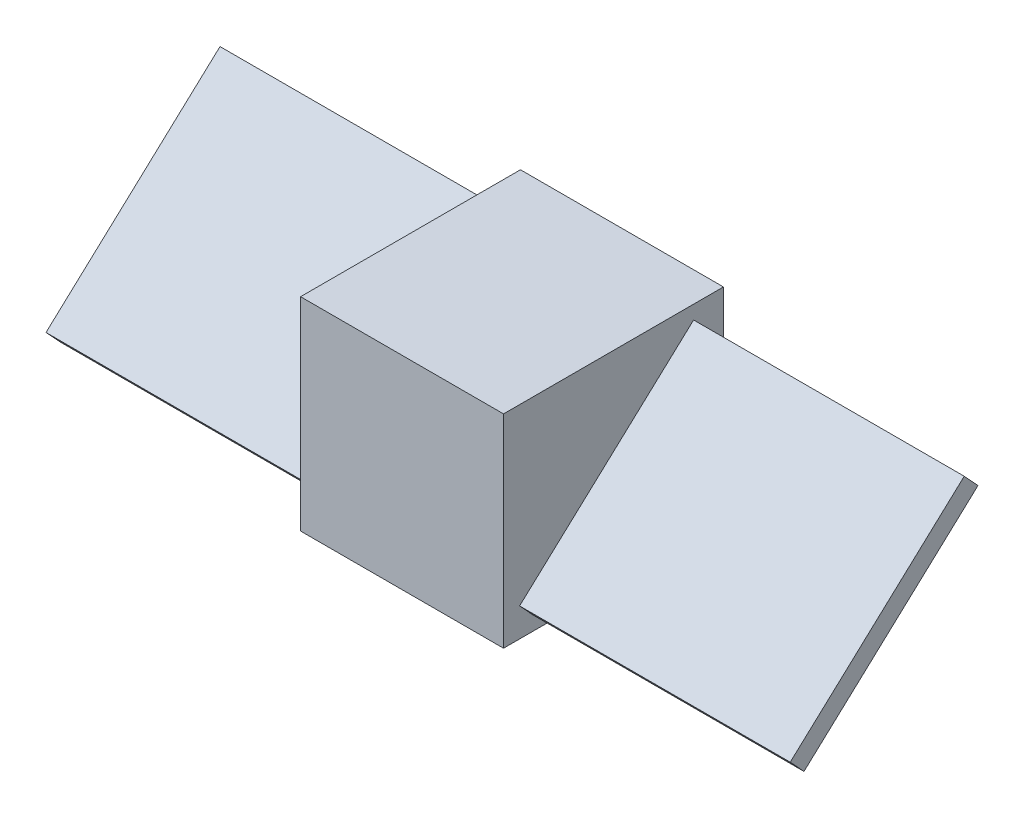
ISO-10303-21;
HEADER;
FILE_DESCRIPTION(('STEP AP214'),'2;1');
FILE_NAME('part.step','',(''),(''),'','','');
FILE_SCHEMA(('AUTOMOTIVE_DESIGN { 1 0 10303 214 1 1 1 1 }'));
ENDSEC;
DATA;
#1=APPLICATION_CONTEXT('core data for automotive mechanical design processes');
#2=APPLICATION_PROTOCOL_DEFINITION('international standard','automotive_design',2000,#1);
#3=PRODUCT_CONTEXT('',#1,'mechanical');
#4=PRODUCT('Part','Part','',(#3));
#5=PRODUCT_RELATED_PRODUCT_CATEGORY('part','',(#4));
#6=PRODUCT_DEFINITION_FORMATION('','',#4);
#7=PRODUCT_DEFINITION_CONTEXT('part definition',#1,'design');
#8=PRODUCT_DEFINITION('design','',#6,#7);
#9=PRODUCT_DEFINITION_SHAPE('','',#8);
#10=(LENGTH_UNIT() NAMED_UNIT(*) SI_UNIT(.MILLI.,.METRE.));
#11=(NAMED_UNIT(*) PLANE_ANGLE_UNIT() SI_UNIT($,.RADIAN.));
#12=(NAMED_UNIT(*) SI_UNIT($,.STERADIAN.) SOLID_ANGLE_UNIT());
#13=UNCERTAINTY_MEASURE_WITH_UNIT(LENGTH_MEASURE(1.E-05),#10,'distance_accuracy_value','');
#14=(GEOMETRIC_REPRESENTATION_CONTEXT(3) GLOBAL_UNCERTAINTY_ASSIGNED_CONTEXT((#13)) GLOBAL_UNIT_ASSIGNED_CONTEXT((#10,
#11,#12)) REPRESENTATION_CONTEXT('',''));
#15=CARTESIAN_POINT('',(0.,0.,0.));
#16=DIRECTION('',(0.,0.,1.));
#17=DIRECTION('',(1.,0.,0.));
#18=AXIS2_PLACEMENT_3D('',#15,#16,#17);
#19=CARTESIAN_POINT('',(-110.,37.5417205285646,-40.6701972392784));
#20=DIRECTION('',(0.,0.678280102733066,-0.734803444627488));
#21=DIRECTION('',(0.,0.734803444627488,0.678280102733066));
#22=AXIS2_PLACEMENT_3D('',#19,#20,#21);
#23=PLANE('',#22);
#24=DIRECTION('',(0.,-0.734803444627488,-0.678280102733066));
#25=VECTOR('',#24,1.);
#26=CARTESIAN_POINT('',(-30.,37.5417205285646,-40.6701972392784));
#27=LINE('',#26,#25);
#28=CARTESIAN_POINT('',(-30.,55.9442139295398,-23.6832802537629));
#29=VERTEX_POINT('',#28);
#30=CARTESIAN_POINT('',(-30.,51.5353932617748,-27.7529608701613));
#31=VERTEX_POINT('',#30);
#32=EDGE_CURVE('E113',#29,#31,#27,.T.);
#33=ORIENTED_EDGE('',*,*,#32,.T.);
#34=DIRECTION('',(1.,0.,0.));
#35=VECTOR('',#34,1.);
#36=CARTESIAN_POINT('',(-110.,51.5353932617748,-27.7529608701613));
#37=LINE('',#36,#35);
#38=CARTESIAN_POINT('',(-110.,51.5353932617748,-27.7529608701613));
#39=VERTEX_POINT('',#38);
#40=EDGE_CURVE('E111',#39,#31,#37,.T.);
#41=ORIENTED_EDGE('',*,*,#40,.F.);
#42=DIRECTION('',(0.,-0.734803444627488,-0.678280102733066));
#43=VECTOR('',#42,1.);
#44=CARTESIAN_POINT('',(-110.,37.5417205285646,-40.6701972392784));
#45=LINE('',#44,#43);
#46=CARTESIAN_POINT('',(-110.,55.9442139295398,-23.6832802537629));
#47=VERTEX_POINT('',#46);
#48=EDGE_CURVE('E108',#47,#39,#45,.T.);
#49=ORIENTED_EDGE('',*,*,#48,.F.);
#50=DIRECTION('',(1.,0.,0.));
#51=VECTOR('',#50,1.);
#52=CARTESIAN_POINT('',(-110.,55.9442139295398,-23.6832802537629));
#53=LINE('',#52,#51);
#54=EDGE_CURVE('E12',#47,#29,#53,.T.);
#55=ORIENTED_EDGE('',*,*,#54,.T.);
#56=EDGE_LOOP('',(#33,#41,#49,#55));
#57=FACE_BOUND('',#56,.T.);
#58=ADVANCED_FACE('F55',(#57),#23,.T.);
#59=CARTESIAN_POINT('',(-110.,18.4024934009751,16.9869169855155));
#60=DIRECTION('',(0.,0.734803444627488,0.678280102733066));
#61=DIRECTION('',(0.,-0.678280102733066,0.734803444627488));
#62=AXIS2_PLACEMENT_3D('',#59,#60,#61);
#63=PLANE('',#62);
#64=DIRECTION('',(0.,0.678280102733066,-0.734803444627488));
#65=VECTOR('',#64,1.);
#66=CARTESIAN_POINT('',(-30.,18.4024934009751,16.9869169855155));
#67=LINE('',#66,#65);
#68=CARTESIAN_POINT('',(-30.,8.46460673822518,27.7529608701613));
#69=VERTEX_POINT('',#68);
#70=EDGE_CURVE('E117',#69,#29,#67,.T.);
#71=ORIENTED_EDGE('',*,*,#70,.T.);
#72=ORIENTED_EDGE('',*,*,#54,.F.);
#73=DIRECTION('',(0.,0.678280102733066,-0.734803444627488));
#74=VECTOR('',#73,1.);
#75=CARTESIAN_POINT('',(-110.,18.4024934009751,16.9869169855155));
#76=LINE('',#75,#74);
#77=CARTESIAN_POINT('',(-110.,8.46460673822518,27.7529608701613));
#78=VERTEX_POINT('',#77);
#79=EDGE_CURVE('E91',#78,#47,#76,.T.);
#80=ORIENTED_EDGE('',*,*,#79,.F.);
#81=DIRECTION('',(1.,0.,0.));
#82=VECTOR('',#81,1.);
#83=CARTESIAN_POINT('',(-110.,8.46460673822518,27.7529608701613));
#84=LINE('',#83,#82);
#85=EDGE_CURVE('E58',#78,#69,#84,.T.);
#86=ORIENTED_EDGE('',*,*,#85,.T.);
#87=EDGE_LOOP('',(#71,#72,#80,#86));
#88=FACE_BOUND('',#87,.T.);
#89=ADVANCED_FACE('F110',(#88),#63,.T.);
#90=CARTESIAN_POINT('',(-110.,-9.93788666274995,10.7660438846458));
#91=DIRECTION('',(0.,0.678280102733066,-0.734803444627488));
#92=DIRECTION('',(0.,0.734803444627488,0.678280102733066));
#93=AXIS2_PLACEMENT_3D('',#90,#91,#92);
#94=PLANE('',#93);
#95=DIRECTION('',(0.,-0.734803444627488,-0.678280102733066));
#96=VECTOR('',#95,1.);
#97=CARTESIAN_POINT('',(-30.,-9.93788666274995,10.7660438846458));
#98=LINE('',#97,#96);
#99=CARTESIAN_POINT('',(-30.,4.05578607046024,23.6832802537629));
#100=VERTEX_POINT('',#99);
#101=EDGE_CURVE('E103',#69,#100,#98,.T.);
#102=ORIENTED_EDGE('',*,*,#101,.F.);
#103=ORIENTED_EDGE('',*,*,#85,.F.);
#104=DIRECTION('',(0.,-0.734803444627488,-0.678280102733066));
#105=VECTOR('',#104,1.);
#106=CARTESIAN_POINT('',(-110.,-9.93788666274995,10.7660438846458));
#107=LINE('',#106,#105);
#108=CARTESIAN_POINT('',(-110.,4.05578607046024,23.6832802537629));
#109=VERTEX_POINT('',#108);
#110=EDGE_CURVE('E96',#78,#109,#107,.T.);
#111=ORIENTED_EDGE('',*,*,#110,.T.);
#112=DIRECTION('',(1.,0.,0.));
#113=VECTOR('',#112,1.);
#114=CARTESIAN_POINT('',(-110.,4.05578607046024,23.6832802537629));
#115=LINE('',#114,#113);
#116=EDGE_CURVE('E106',#109,#100,#115,.T.);
#117=ORIENTED_EDGE('',*,*,#116,.T.);
#118=EDGE_LOOP('',(#102,#103,#111,#117));
#119=FACE_BOUND('',#118,.T.);
#120=ADVANCED_FACE('F105',(#119),#94,.F.);
#121=CARTESIAN_POINT('',(-110.,13.9936727332102,12.9172363691171));
#122=DIRECTION('',(0.,0.734803444627488,0.678280102733066));
#123=DIRECTION('',(0.,-0.678280102733066,0.734803444627488));
#124=AXIS2_PLACEMENT_3D('',#121,#122,#123);
#125=PLANE('',#124);
#126=DIRECTION('',(0.,0.678280102733066,-0.734803444627488));
#127=VECTOR('',#126,1.);
#128=CARTESIAN_POINT('',(-30.,13.9936727332102,12.9172363691171));
#129=LINE('',#128,#127);
#130=EDGE_CURVE('E85',#100,#31,#129,.T.);
#131=ORIENTED_EDGE('',*,*,#130,.F.);
#132=ORIENTED_EDGE('',*,*,#116,.F.);
#133=DIRECTION('',(0.,0.678280102733066,-0.734803444627488));
#134=VECTOR('',#133,1.);
#135=CARTESIAN_POINT('',(-110.,13.9936727332102,12.9172363691171));
#136=LINE('',#135,#134);
#137=EDGE_CURVE('E69',#109,#39,#136,.T.);
#138=ORIENTED_EDGE('',*,*,#137,.T.);
#139=ORIENTED_EDGE('',*,*,#40,.T.);
#140=EDGE_LOOP('',(#131,#132,#138,#139));
#141=FACE_BOUND('',#140,.T.);
#142=ADVANCED_FACE('F127',(#141),#125,.F.);
#143=CARTESIAN_POINT('',(-110.,0.,0.));
#144=DIRECTION('',(-1.,0.,0.));
#145=DIRECTION('',(0.,0.,-1.));
#146=AXIS2_PLACEMENT_3D('',#143,#144,#145);
#147=PLANE('',#146);
#148=ORIENTED_EDGE('',*,*,#48,.T.);
#149=ORIENTED_EDGE('',*,*,#137,.F.);
#150=ORIENTED_EDGE('',*,*,#110,.F.);
#151=ORIENTED_EDGE('',*,*,#79,.T.);
#152=EDGE_LOOP('',(#148,#149,#150,#151));
#153=FACE_BOUND('',#152,.T.);
#154=ADVANCED_FACE('F98',(#153),#147,.T.);
#155=CARTESIAN_POINT('',(-30.,0.,0.));
#156=DIRECTION('',(-1.,0.,0.));
#157=DIRECTION('',(0.,0.,-1.));
#158=AXIS2_PLACEMENT_3D('',#155,#156,#157);
#159=PLANE('',#158);
#160=ORIENTED_EDGE('',*,*,#32,.F.);
#161=ORIENTED_EDGE('',*,*,#70,.F.);
#162=ORIENTED_EDGE('',*,*,#101,.T.);
#163=ORIENTED_EDGE('',*,*,#130,.T.);
#164=EDGE_LOOP('',(#160,#161,#162,#163));
#165=FACE_BOUND('',#164,.T.);
#166=ADVANCED_FACE('F124',(#165),#159,.F.);
#167=CLOSED_SHELL('',(#58,#89,#120,#142,#154,#166));
#168=MANIFOLD_SOLID_BREP('B2',#167);
#169=CARTESIAN_POINT('',(110.,37.5417205285646,-40.6701972392784));
#170=DIRECTION('',(0.,0.678280102733066,-0.734803444627488));
#171=DIRECTION('',(0.,0.734803444627488,0.678280102733066));
#172=AXIS2_PLACEMENT_3D('',#169,#170,#171);
#173=PLANE('',#172);
#174=DIRECTION('',(0.,-0.734803444627488,-0.678280102733066));
#175=VECTOR('',#174,1.);
#176=CARTESIAN_POINT('',(30.,37.5417205285646,-40.6701972392784));
#177=LINE('',#176,#175);
#178=CARTESIAN_POINT('',(30.,55.9442139295398,-23.6832802537629));
#179=VERTEX_POINT('',#178);
#180=CARTESIAN_POINT('',(30.,51.5353932617748,-27.7529608701613));
#181=VERTEX_POINT('',#180);
#182=EDGE_CURVE('E249',#179,#181,#177,.T.);
#183=ORIENTED_EDGE('',*,*,#182,.F.);
#184=DIRECTION('',(-1.,0.,0.));
#185=VECTOR('',#184,1.);
#186=CARTESIAN_POINT('',(110.,55.9442139295398,-23.6832802537629));
#187=LINE('',#186,#185);
#188=CARTESIAN_POINT('',(110.,55.9442139295398,-23.6832802537629));
#189=VERTEX_POINT('',#188);
#190=EDGE_CURVE('E49',#189,#179,#187,.T.);
#191=ORIENTED_EDGE('',*,*,#190,.F.);
#192=DIRECTION('',(0.,-0.734803444627488,-0.678280102733066));
#193=VECTOR('',#192,1.);
#194=CARTESIAN_POINT('',(110.,37.5417205285646,-40.6701972392784));
#195=LINE('',#194,#193);
#196=CARTESIAN_POINT('',(110.,51.5353932617748,-27.7529608701613));
#197=VERTEX_POINT('',#196);
#198=EDGE_CURVE('E244',#189,#197,#195,.T.);
#199=ORIENTED_EDGE('',*,*,#198,.T.);
#200=DIRECTION('',(-1.,0.,0.));
#201=VECTOR('',#200,1.);
#202=CARTESIAN_POINT('',(110.,51.5353932617748,-27.7529608701613));
#203=LINE('',#202,#201);
#204=EDGE_CURVE('E224',#197,#181,#203,.T.);
#205=ORIENTED_EDGE('',*,*,#204,.T.);
#206=EDGE_LOOP('',(#183,#191,#199,#205));
#207=FACE_BOUND('',#206,.T.);
#208=ADVANCED_FACE('F183',(#207),#173,.T.);
#209=CARTESIAN_POINT('',(110.,18.4024934009751,16.9869169855155));
#210=DIRECTION('',(0.,0.734803444627488,0.678280102733066));
#211=DIRECTION('',(0.,-0.678280102733066,0.734803444627488));
#212=AXIS2_PLACEMENT_3D('',#209,#210,#211);
#213=PLANE('',#212);
#214=DIRECTION('',(0.,0.678280102733066,-0.734803444627488));
#215=VECTOR('',#214,1.);
#216=CARTESIAN_POINT('',(30.,18.4024934009751,16.9869169855155));
#217=LINE('',#216,#215);
#218=CARTESIAN_POINT('',(30.,8.46460673822518,27.7529608701613));
#219=VERTEX_POINT('',#218);
#220=EDGE_CURVE('E237',#219,#179,#217,.T.);
#221=ORIENTED_EDGE('',*,*,#220,.F.);
#222=DIRECTION('',(-1.,0.,0.));
#223=VECTOR('',#222,1.);
#224=CARTESIAN_POINT('',(110.,8.46460673822518,27.7529608701613));
#225=LINE('',#224,#223);
#226=CARTESIAN_POINT('',(110.,8.46460673822518,27.7529608701613));
#227=VERTEX_POINT('',#226);
#228=EDGE_CURVE('E194',#227,#219,#225,.T.);
#229=ORIENTED_EDGE('',*,*,#228,.F.);
#230=DIRECTION('',(0.,0.678280102733066,-0.734803444627488));
#231=VECTOR('',#230,1.);
#232=CARTESIAN_POINT('',(110.,18.4024934009751,16.9869169855155));
#233=LINE('',#232,#231);
#234=EDGE_CURVE('E231',#227,#189,#233,.T.);
#235=ORIENTED_EDGE('',*,*,#234,.T.);
#236=ORIENTED_EDGE('',*,*,#190,.T.);
#237=EDGE_LOOP('',(#221,#229,#235,#236));
#238=FACE_BOUND('',#237,.T.);
#239=ADVANCED_FACE('F235',(#238),#213,.T.);
#240=CARTESIAN_POINT('',(110.,-9.93788666274995,10.7660438846458));
#241=DIRECTION('',(0.,0.678280102733066,-0.734803444627488));
#242=DIRECTION('',(0.,0.734803444627488,0.678280102733066));
#243=AXIS2_PLACEMENT_3D('',#240,#241,#242);
#244=PLANE('',#243);
#245=DIRECTION('',(0.,-0.734803444627488,-0.678280102733066));
#246=VECTOR('',#245,1.);
#247=CARTESIAN_POINT('',(30.,-9.93788666274995,10.7660438846458));
#248=LINE('',#247,#246);
#249=CARTESIAN_POINT('',(30.,4.05578607046024,23.6832802537629));
#250=VERTEX_POINT('',#249);
#251=EDGE_CURVE('E216',#219,#250,#248,.T.);
#252=ORIENTED_EDGE('',*,*,#251,.T.);
#253=DIRECTION('',(-1.,0.,0.));
#254=VECTOR('',#253,1.);
#255=CARTESIAN_POINT('',(110.,4.05578607046024,23.6832802537629));
#256=LINE('',#255,#254);
#257=CARTESIAN_POINT('',(110.,4.05578607046024,23.6832802537629));
#258=VERTEX_POINT('',#257);
#259=EDGE_CURVE('E240',#258,#250,#256,.T.);
#260=ORIENTED_EDGE('',*,*,#259,.F.);
#261=DIRECTION('',(0.,-0.734803444627488,-0.678280102733066));
#262=VECTOR('',#261,1.);
#263=CARTESIAN_POINT('',(110.,-9.93788666274995,10.7660438846458));
#264=LINE('',#263,#262);
#265=EDGE_CURVE('E236',#227,#258,#264,.T.);
#266=ORIENTED_EDGE('',*,*,#265,.F.);
#267=ORIENTED_EDGE('',*,*,#228,.T.);
#268=EDGE_LOOP('',(#252,#260,#266,#267));
#269=FACE_BOUND('',#268,.T.);
#270=ADVANCED_FACE('F239',(#269),#244,.F.);
#271=CARTESIAN_POINT('',(110.,13.9936727332102,12.9172363691171));
#272=DIRECTION('',(0.,0.734803444627488,0.678280102733066));
#273=DIRECTION('',(0.,-0.678280102733066,0.734803444627488));
#274=AXIS2_PLACEMENT_3D('',#271,#272,#273);
#275=PLANE('',#274);
#276=DIRECTION('',(0.,0.678280102733066,-0.734803444627488));
#277=VECTOR('',#276,1.);
#278=CARTESIAN_POINT('',(30.,13.9936727332102,12.9172363691171));
#279=LINE('',#278,#277);
#280=EDGE_CURVE('E245',#250,#181,#279,.T.);
#281=ORIENTED_EDGE('',*,*,#280,.T.);
#282=ORIENTED_EDGE('',*,*,#204,.F.);
#283=DIRECTION('',(0.,0.678280102733066,-0.734803444627488));
#284=VECTOR('',#283,1.);
#285=CARTESIAN_POINT('',(110.,13.9936727332102,12.9172363691171));
#286=LINE('',#285,#284);
#287=EDGE_CURVE('E203',#258,#197,#286,.T.);
#288=ORIENTED_EDGE('',*,*,#287,.F.);
#289=ORIENTED_EDGE('',*,*,#259,.T.);
#290=EDGE_LOOP('',(#281,#282,#288,#289));
#291=FACE_BOUND('',#290,.T.);
#292=ADVANCED_FACE('F260',(#291),#275,.F.);
#293=CARTESIAN_POINT('',(110.,0.,0.));
#294=DIRECTION('',(1.,0.,0.));
#295=DIRECTION('',(0.,0.,-1.));
#296=AXIS2_PLACEMENT_3D('',#293,#294,#295);
#297=PLANE('',#296);
#298=ORIENTED_EDGE('',*,*,#198,.F.);
#299=ORIENTED_EDGE('',*,*,#234,.F.);
#300=ORIENTED_EDGE('',*,*,#265,.T.);
#301=ORIENTED_EDGE('',*,*,#287,.T.);
#302=EDGE_LOOP('',(#298,#299,#300,#301));
#303=FACE_BOUND('',#302,.T.);
#304=ADVANCED_FACE('F243',(#303),#297,.T.);
#305=CARTESIAN_POINT('',(30.,0.,0.));
#306=DIRECTION('',(1.,0.,0.));
#307=DIRECTION('',(0.,0.,-1.));
#308=AXIS2_PLACEMENT_3D('',#305,#306,#307);
#309=PLANE('',#308);
#310=ORIENTED_EDGE('',*,*,#182,.T.);
#311=ORIENTED_EDGE('',*,*,#280,.F.);
#312=ORIENTED_EDGE('',*,*,#251,.F.);
#313=ORIENTED_EDGE('',*,*,#220,.T.);
#314=EDGE_LOOP('',(#310,#311,#312,#313));
#315=FACE_BOUND('',#314,.T.);
#316=ADVANCED_FACE('F259',(#315),#309,.F.);
#317=CLOSED_SHELL('',(#208,#239,#270,#292,#304,#316));
#318=MANIFOLD_SOLID_BREP('B6',#317);
#319=CARTESIAN_POINT('',(30.,60.,32.5));
#320=DIRECTION('',(-1.,0.,0.));
#321=DIRECTION('',(0.,0.,1.));
#322=AXIS2_PLACEMENT_3D('',#319,#320,#321);
#323=PLANE('',#322);
#324=DIRECTION('',(0.,0.,-1.));
#325=VECTOR('',#324,1.);
#326=CARTESIAN_POINT('',(30.,0.,32.5));
#327=LINE('',#326,#325);
#328=CARTESIAN_POINT('',(30.,0.,32.5));
#329=VERTEX_POINT('',#328);
#330=CARTESIAN_POINT('',(30.,0.,-32.5));
#331=VERTEX_POINT('',#330);
#332=EDGE_CURVE('E375',#329,#331,#327,.T.);
#333=ORIENTED_EDGE('',*,*,#332,.T.);
#334=DIRECTION('',(0.,-1.,0.));
#335=VECTOR('',#334,1.);
#336=CARTESIAN_POINT('',(30.,60.,-32.5));
#337=LINE('',#336,#335);
#338=CARTESIAN_POINT('',(30.,60.,-32.5));
#339=VERTEX_POINT('',#338);
#340=EDGE_CURVE('E181',#339,#331,#337,.T.);
#341=ORIENTED_EDGE('',*,*,#340,.F.);
#342=DIRECTION('',(0.,0.,-1.));
#343=VECTOR('',#342,1.);
#344=CARTESIAN_POINT('',(30.,60.,32.5));
#345=LINE('',#344,#343);
#346=CARTESIAN_POINT('',(30.,60.,32.5));
#347=VERTEX_POINT('',#346);
#348=EDGE_CURVE('E358',#347,#339,#345,.T.);
#349=ORIENTED_EDGE('',*,*,#348,.F.);
#350=DIRECTION('',(0.,-1.,0.));
#351=VECTOR('',#350,1.);
#352=CARTESIAN_POINT('',(30.,60.,32.5));
#353=LINE('',#352,#351);
#354=EDGE_CURVE('E366',#347,#329,#353,.T.);
#355=ORIENTED_EDGE('',*,*,#354,.T.);
#356=EDGE_LOOP('',(#333,#341,#349,#355));
#357=FACE_BOUND('',#356,.T.);
#358=ADVANCED_FACE('F310',(#357),#323,.F.);
#359=CARTESIAN_POINT('',(-30.,60.,-32.5));
#360=DIRECTION('',(0.,0.,1.));
#361=DIRECTION('',(1.,0.,0.));
#362=AXIS2_PLACEMENT_3D('',#359,#360,#361);
#363=PLANE('',#362);
#364=DIRECTION('',(-1.,0.,0.));
#365=VECTOR('',#364,1.);
#366=CARTESIAN_POINT('',(-30.,0.,-32.5));
#367=LINE('',#366,#365);
#368=CARTESIAN_POINT('',(-30.,0.,-32.5));
#369=VERTEX_POINT('',#368);
#370=EDGE_CURVE('E365',#331,#369,#367,.T.);
#371=ORIENTED_EDGE('',*,*,#370,.T.);
#372=DIRECTION('',(0.,-1.,0.));
#373=VECTOR('',#372,1.);
#374=CARTESIAN_POINT('',(-30.,60.,-32.5));
#375=LINE('',#374,#373);
#376=CARTESIAN_POINT('',(-30.,60.,-32.5));
#377=VERTEX_POINT('',#376);
#378=EDGE_CURVE('E320',#377,#369,#375,.T.);
#379=ORIENTED_EDGE('',*,*,#378,.F.);
#380=DIRECTION('',(-1.,0.,0.));
#381=VECTOR('',#380,1.);
#382=CARTESIAN_POINT('',(-30.,60.,-32.5));
#383=LINE('',#382,#381);
#384=EDGE_CURVE('E351',#339,#377,#383,.T.);
#385=ORIENTED_EDGE('',*,*,#384,.F.);
#386=ORIENTED_EDGE('',*,*,#340,.T.);
#387=EDGE_LOOP('',(#371,#379,#385,#386));
#388=FACE_BOUND('',#387,.T.);
#389=ADVANCED_FACE('F361',(#388),#363,.F.);
#390=CARTESIAN_POINT('',(-30.,60.,32.5));
#391=DIRECTION('',(1.,0.,0.));
#392=DIRECTION('',(0.,0.,-1.));
#393=AXIS2_PLACEMENT_3D('',#390,#391,#392);
#394=PLANE('',#393);
#395=DIRECTION('',(0.,0.,1.));
#396=VECTOR('',#395,1.);
#397=CARTESIAN_POINT('',(-30.,0.,32.5));
#398=LINE('',#397,#396);
#399=CARTESIAN_POINT('',(-30.,0.,32.5));
#400=VERTEX_POINT('',#399);
#401=EDGE_CURVE('E345',#369,#400,#398,.T.);
#402=ORIENTED_EDGE('',*,*,#401,.T.);
#403=DIRECTION('',(0.,-1.,0.));
#404=VECTOR('',#403,1.);
#405=CARTESIAN_POINT('',(-30.,60.,32.5));
#406=LINE('',#405,#404);
#407=CARTESIAN_POINT('',(-30.,60.,32.5));
#408=VERTEX_POINT('',#407);
#409=EDGE_CURVE('E364',#408,#400,#406,.T.);
#410=ORIENTED_EDGE('',*,*,#409,.F.);
#411=DIRECTION('',(0.,0.,1.));
#412=VECTOR('',#411,1.);
#413=CARTESIAN_POINT('',(-30.,60.,32.5));
#414=LINE('',#413,#412);
#415=EDGE_CURVE('E359',#377,#408,#414,.T.);
#416=ORIENTED_EDGE('',*,*,#415,.F.);
#417=ORIENTED_EDGE('',*,*,#378,.T.);
#418=EDGE_LOOP('',(#402,#410,#416,#417));
#419=FACE_BOUND('',#418,.T.);
#420=ADVANCED_FACE('F368',(#419),#394,.F.);
#421=CARTESIAN_POINT('',(-30.,60.,32.5));
#422=DIRECTION('',(0.,0.,-1.));
#423=DIRECTION('',(-1.,0.,0.));
#424=AXIS2_PLACEMENT_3D('',#421,#422,#423);
#425=PLANE('',#424);
#426=DIRECTION('',(1.,0.,0.));
#427=VECTOR('',#426,1.);
#428=CARTESIAN_POINT('',(-30.,0.,32.5));
#429=LINE('',#428,#427);
#430=EDGE_CURVE('E346',#400,#329,#429,.T.);
#431=ORIENTED_EDGE('',*,*,#430,.T.);
#432=ORIENTED_EDGE('',*,*,#354,.F.);
#433=DIRECTION('',(1.,0.,0.));
#434=VECTOR('',#433,1.);
#435=CARTESIAN_POINT('',(-30.,60.,32.5));
#436=LINE('',#435,#434);
#437=EDGE_CURVE('E324',#408,#347,#436,.T.);
#438=ORIENTED_EDGE('',*,*,#437,.F.);
#439=ORIENTED_EDGE('',*,*,#409,.T.);
#440=EDGE_LOOP('',(#431,#432,#438,#439));
#441=FACE_BOUND('',#440,.T.);
#442=ADVANCED_FACE('F377',(#441),#425,.F.);
#443=CARTESIAN_POINT('',(0.,60.,0.));
#444=DIRECTION('',(0.,-1.,0.));
#445=DIRECTION('',(0.,0.,-1.));
#446=AXIS2_PLACEMENT_3D('',#443,#444,#445);
#447=PLANE('',#446);
#448=ORIENTED_EDGE('',*,*,#348,.T.);
#449=ORIENTED_EDGE('',*,*,#384,.T.);
#450=ORIENTED_EDGE('',*,*,#415,.T.);
#451=ORIENTED_EDGE('',*,*,#437,.T.);
#452=EDGE_LOOP('',(#448,#449,#450,#451));
#453=FACE_BOUND('',#452,.T.);
#454=ADVANCED_FACE('F357',(#453),#447,.F.);
#455=CARTESIAN_POINT('',(0.,0.,0.));
#456=DIRECTION('',(0.,-1.,0.));
#457=DIRECTION('',(0.,0.,-1.));
#458=AXIS2_PLACEMENT_3D('',#455,#456,#457);
#459=PLANE('',#458);
#460=ORIENTED_EDGE('',*,*,#332,.F.);
#461=ORIENTED_EDGE('',*,*,#430,.F.);
#462=ORIENTED_EDGE('',*,*,#401,.F.);
#463=ORIENTED_EDGE('',*,*,#370,.F.);
#464=EDGE_LOOP('',(#460,#461,#462,#463));
#465=FACE_BOUND('',#464,.T.);
#466=ADVANCED_FACE('F385',(#465),#459,.T.);
#467=CLOSED_SHELL('',(#358,#389,#420,#442,#454,#466));
#468=MANIFOLD_SOLID_BREP('B42',#467);
#469=ADVANCED_BREP_SHAPE_REPRESENTATION('',(#18,#168,#318,#468),#14);
#470=SHAPE_DEFINITION_REPRESENTATION(#9,#469);
ENDSEC;
END-ISO-10303-21;
